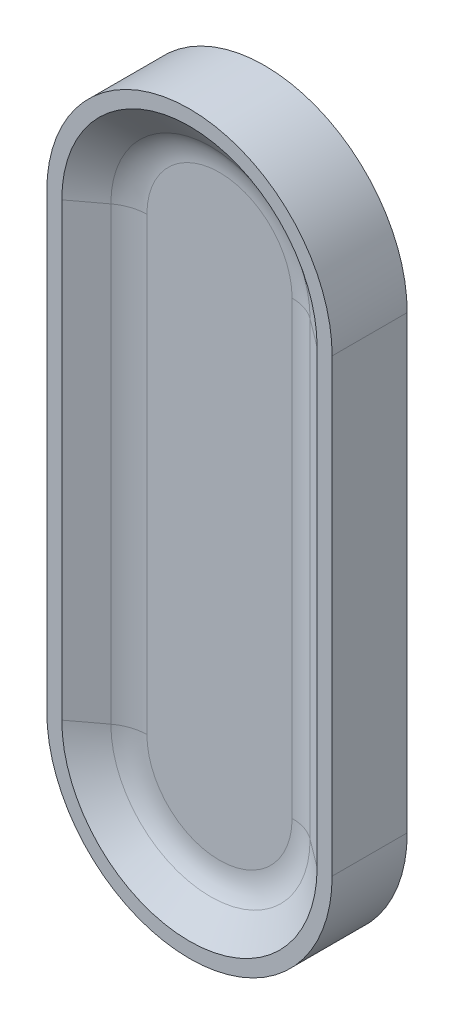
ISO-10303-21;
HEADER;
FILE_DESCRIPTION(('STEP AP214'),'2;1');
FILE_NAME('part.step','',(''),(''),'','','');
FILE_SCHEMA(('AUTOMOTIVE_DESIGN { 1 0 10303 214 1 1 1 1 }'));
ENDSEC;
DATA;
#1=APPLICATION_CONTEXT('core data for automotive mechanical design processes');
#2=APPLICATION_PROTOCOL_DEFINITION('international standard','automotive_design',2000,#1);
#3=PRODUCT_CONTEXT('',#1,'mechanical');
#4=PRODUCT('Part','Part','',(#3));
#5=PRODUCT_RELATED_PRODUCT_CATEGORY('part','',(#4));
#6=PRODUCT_DEFINITION_FORMATION('','',#4);
#7=PRODUCT_DEFINITION_CONTEXT('part definition',#1,'design');
#8=PRODUCT_DEFINITION('design','',#6,#7);
#9=PRODUCT_DEFINITION_SHAPE('','',#8);
#10=(LENGTH_UNIT() NAMED_UNIT(*) SI_UNIT(.MILLI.,.METRE.));
#11=(NAMED_UNIT(*) PLANE_ANGLE_UNIT() SI_UNIT($,.RADIAN.));
#12=(NAMED_UNIT(*) SI_UNIT($,.STERADIAN.) SOLID_ANGLE_UNIT());
#13=UNCERTAINTY_MEASURE_WITH_UNIT(LENGTH_MEASURE(1.E-05),#10,'distance_accuracy_value','');
#14=(GEOMETRIC_REPRESENTATION_CONTEXT(3) GLOBAL_UNCERTAINTY_ASSIGNED_CONTEXT((#13)) GLOBAL_UNIT_ASSIGNED_CONTEXT((#10,
#11,#12)) REPRESENTATION_CONTEXT('',''));
#15=CARTESIAN_POINT('',(0.,0.,0.));
#16=DIRECTION('',(0.,0.,1.));
#17=DIRECTION('',(1.,0.,0.));
#18=AXIS2_PLACEMENT_3D('',#15,#16,#17);
#19=CARTESIAN_POINT('',(0.,-15.,5.));
#20=DIRECTION('',(0.,0.,-1.));
#21=DIRECTION('',(-1.,0.,0.));
#22=AXIS2_PLACEMENT_3D('',#19,#20,#21);
#23=CYLINDRICAL_SURFACE('',#22,9.50000000000001);
#24=CARTESIAN_POINT('',(0.,-15.,0.));
#25=DIRECTION('',(0.,0.,1.));
#26=DIRECTION('',(1.,0.,0.));
#27=AXIS2_PLACEMENT_3D('',#24,#25,#26);
#28=CIRCLE('',#27,9.50000000000001);
#29=CARTESIAN_POINT('',(-9.50000000000001,-15.,0.));
#30=VERTEX_POINT('',#29);
#31=CARTESIAN_POINT('',(9.50000000000001,-15.,0.));
#32=VERTEX_POINT('',#31);
#33=EDGE_CURVE('E140',#30,#32,#28,.T.);
#34=ORIENTED_EDGE('',*,*,#33,.T.);
#35=DIRECTION('',(0.,0.,-1.));
#36=VECTOR('',#35,1.);
#37=CARTESIAN_POINT('',(9.50000000000001,-15.,5.));
#38=LINE('',#37,#36);
#39=CARTESIAN_POINT('',(9.50000000000001,-15.,5.));
#40=VERTEX_POINT('',#39);
#41=EDGE_CURVE('E121',#40,#32,#38,.T.);
#42=ORIENTED_EDGE('',*,*,#41,.F.);
#43=CARTESIAN_POINT('',(0.,-15.,5.));
#44=DIRECTION('',(0.,0.,1.));
#45=DIRECTION('',(1.,0.,0.));
#46=AXIS2_PLACEMENT_3D('',#43,#44,#45);
#47=CIRCLE('',#46,9.50000000000001);
#48=CARTESIAN_POINT('',(-9.50000000000001,-15.,5.));
#49=VERTEX_POINT('',#48);
#50=EDGE_CURVE('E128',#49,#40,#47,.T.);
#51=ORIENTED_EDGE('',*,*,#50,.F.);
#52=DIRECTION('',(0.,0.,-1.));
#53=VECTOR('',#52,1.);
#54=CARTESIAN_POINT('',(-9.50000000000001,-15.,5.));
#55=LINE('',#54,#53);
#56=EDGE_CURVE('E322',#49,#30,#55,.T.);
#57=ORIENTED_EDGE('',*,*,#56,.T.);
#58=EDGE_LOOP('',(#34,#42,#51,#57));
#59=FACE_BOUND('',#58,.T.);
#60=ADVANCED_FACE('F39',(#59),#23,.T.);
#61=CARTESIAN_POINT('',(9.50000000000001,-15.,5.));
#62=DIRECTION('',(-1.,0.,0.));
#63=DIRECTION('',(0.,-1.,0.));
#64=AXIS2_PLACEMENT_3D('',#61,#62,#63);
#65=PLANE('',#64);
#66=DIRECTION('',(0.,1.,0.));
#67=VECTOR('',#66,1.);
#68=CARTESIAN_POINT('',(9.50000000000001,-15.,0.));
#69=LINE('',#68,#67);
#70=CARTESIAN_POINT('',(9.5,15.,0.));
#71=VERTEX_POINT('',#70);
#72=EDGE_CURVE('E320',#32,#71,#69,.T.);
#73=ORIENTED_EDGE('',*,*,#72,.T.);
#74=DIRECTION('',(0.,0.,-1.));
#75=VECTOR('',#74,1.);
#76=CARTESIAN_POINT('',(9.5,15.,5.));
#77=LINE('',#76,#75);
#78=CARTESIAN_POINT('',(9.5,15.,5.));
#79=VERTEX_POINT('',#78);
#80=EDGE_CURVE('E124',#79,#71,#77,.T.);
#81=ORIENTED_EDGE('',*,*,#80,.F.);
#82=DIRECTION('',(0.,1.,0.));
#83=VECTOR('',#82,1.);
#84=CARTESIAN_POINT('',(9.50000000000001,-15.,5.));
#85=LINE('',#84,#83);
#86=EDGE_CURVE('E117',#40,#79,#85,.T.);
#87=ORIENTED_EDGE('',*,*,#86,.F.);
#88=ORIENTED_EDGE('',*,*,#41,.T.);
#89=EDGE_LOOP('',(#73,#81,#87,#88));
#90=FACE_BOUND('',#89,.T.);
#91=ADVANCED_FACE('F119',(#90),#65,.F.);
#92=CARTESIAN_POINT('',(0.,15.,5.));
#93=DIRECTION('',(0.,0.,-1.));
#94=DIRECTION('',(-1.,0.,0.));
#95=AXIS2_PLACEMENT_3D('',#92,#93,#94);
#96=CYLINDRICAL_SURFACE('',#95,9.50000000000001);
#97=CARTESIAN_POINT('',(0.,15.,0.));
#98=DIRECTION('',(0.,0.,1.));
#99=DIRECTION('',(1.,0.,0.));
#100=AXIS2_PLACEMENT_3D('',#97,#98,#99);
#101=CIRCLE('',#100,9.50000000000001);
#102=CARTESIAN_POINT('',(-9.50000000000001,15.,0.));
#103=VERTEX_POINT('',#102);
#104=EDGE_CURVE('E317',#71,#103,#101,.T.);
#105=ORIENTED_EDGE('',*,*,#104,.T.);
#106=DIRECTION('',(0.,0.,-1.));
#107=VECTOR('',#106,1.);
#108=CARTESIAN_POINT('',(-9.50000000000001,15.,5.));
#109=LINE('',#108,#107);
#110=CARTESIAN_POINT('',(-9.50000000000001,15.,5.));
#111=VERTEX_POINT('',#110);
#112=EDGE_CURVE('E145',#111,#103,#109,.T.);
#113=ORIENTED_EDGE('',*,*,#112,.F.);
#114=CARTESIAN_POINT('',(0.,15.,5.));
#115=DIRECTION('',(0.,0.,1.));
#116=DIRECTION('',(1.,0.,0.));
#117=AXIS2_PLACEMENT_3D('',#114,#115,#116);
#118=CIRCLE('',#117,9.50000000000001);
#119=EDGE_CURVE('E127',#79,#111,#118,.T.);
#120=ORIENTED_EDGE('',*,*,#119,.F.);
#121=ORIENTED_EDGE('',*,*,#80,.T.);
#122=EDGE_LOOP('',(#105,#113,#120,#121));
#123=FACE_BOUND('',#122,.T.);
#124=ADVANCED_FACE('F229',(#123),#96,.T.);
#125=CARTESIAN_POINT('',(-9.50000000000001,-15.,5.));
#126=DIRECTION('',(1.,0.,0.));
#127=DIRECTION('',(0.,1.,0.));
#128=AXIS2_PLACEMENT_3D('',#125,#126,#127);
#129=PLANE('',#128);
#130=DIRECTION('',(0.,-1.,0.));
#131=VECTOR('',#130,1.);
#132=CARTESIAN_POINT('',(-9.50000000000001,-15.,0.));
#133=LINE('',#132,#131);
#134=EDGE_CURVE('E137',#103,#30,#133,.T.);
#135=ORIENTED_EDGE('',*,*,#134,.T.);
#136=ORIENTED_EDGE('',*,*,#56,.F.);
#137=DIRECTION('',(0.,-1.,0.));
#138=VECTOR('',#137,1.);
#139=CARTESIAN_POINT('',(-9.50000000000001,-15.,5.));
#140=LINE('',#139,#138);
#141=EDGE_CURVE('E133',#111,#49,#140,.T.);
#142=ORIENTED_EDGE('',*,*,#141,.F.);
#143=ORIENTED_EDGE('',*,*,#112,.T.);
#144=EDGE_LOOP('',(#135,#136,#142,#143));
#145=FACE_BOUND('',#144,.T.);
#146=ADVANCED_FACE('F279',(#145),#129,.F.);
#147=CARTESIAN_POINT('',(0.,-15.,5.));
#148=DIRECTION('',(0.,0.,1.));
#149=DIRECTION('',(1.,0.,0.));
#150=AXIS2_PLACEMENT_3D('',#147,#148,#149);
#151=PLANE('',#150);
#152=DIRECTION('',(0.,-1.,0.));
#153=VECTOR('',#152,1.);
#154=CARTESIAN_POINT('',(8.50000000000001,-15.,5.));
#155=LINE('',#154,#153);
#156=CARTESIAN_POINT('',(8.5,15.,5.));
#157=VERTEX_POINT('',#156);
#158=CARTESIAN_POINT('',(8.50000000000001,-15.,5.));
#159=VERTEX_POINT('',#158);
#160=EDGE_CURVE('E151',#157,#159,#155,.T.);
#161=ORIENTED_EDGE('',*,*,#160,.T.);
#162=CARTESIAN_POINT('',(0.,-15.,5.));
#163=DIRECTION('',(0.,0.,1.));
#164=DIRECTION('',(1.,0.,0.));
#165=AXIS2_PLACEMENT_3D('',#162,#163,#164);
#166=CIRCLE('',#165,8.50000000000001);
#167=CARTESIAN_POINT('',(-8.50000000000001,-15.,5.));
#168=VERTEX_POINT('',#167);
#169=EDGE_CURVE('E153',#159,#168,#166,.F.);
#170=ORIENTED_EDGE('',*,*,#169,.T.);
#171=DIRECTION('',(0.,1.,0.));
#172=VECTOR('',#171,1.);
#173=CARTESIAN_POINT('',(-8.50000000000001,15.,5.));
#174=LINE('',#173,#172);
#175=CARTESIAN_POINT('',(-8.50000000000001,15.,5.));
#176=VERTEX_POINT('',#175);
#177=EDGE_CURVE('E143',#168,#176,#174,.T.);
#178=ORIENTED_EDGE('',*,*,#177,.T.);
#179=CARTESIAN_POINT('',(0.,15.,5.));
#180=DIRECTION('',(0.,0.,1.));
#181=DIRECTION('',(1.,0.,0.));
#182=AXIS2_PLACEMENT_3D('',#179,#180,#181);
#183=CIRCLE('',#182,8.50000000000001);
#184=EDGE_CURVE('E141',#176,#157,#183,.F.);
#185=ORIENTED_EDGE('',*,*,#184,.T.);
#186=EDGE_LOOP('',(#161,#170,#178,#185));
#187=FACE_BOUND('',#186,.T.);
#188=ORIENTED_EDGE('',*,*,#50,.T.);
#189=ORIENTED_EDGE('',*,*,#86,.T.);
#190=ORIENTED_EDGE('',*,*,#119,.T.);
#191=ORIENTED_EDGE('',*,*,#141,.T.);
#192=EDGE_LOOP('',(#188,#189,#190,#191));
#193=FACE_BOUND('',#192,.T.);
#194=ADVANCED_FACE('F131',(#187,#193),#151,.T.);
#195=CARTESIAN_POINT('',(0.,-15.,0.));
#196=DIRECTION('',(0.,0.,1.));
#197=DIRECTION('',(1.,0.,0.));
#198=AXIS2_PLACEMENT_3D('',#195,#196,#197);
#199=PLANE('',#198);
#200=ORIENTED_EDGE('',*,*,#33,.F.);
#201=ORIENTED_EDGE('',*,*,#134,.F.);
#202=ORIENTED_EDGE('',*,*,#104,.F.);
#203=ORIENTED_EDGE('',*,*,#72,.F.);
#204=EDGE_LOOP('',(#200,#201,#202,#203));
#205=FACE_BOUND('',#204,.T.);
#206=ADVANCED_FACE('F213',(#205),#199,.F.);
#207=CARTESIAN_POINT('',(0.,0.,3.));
#208=DIRECTION('',(0.,0.,1.));
#209=DIRECTION('',(1.,0.,0.));
#210=AXIS2_PLACEMENT_3D('',#207,#208,#209);
#211=PLANE('',#210);
#212=CARTESIAN_POINT('',(0.,-15.,3.));
#213=DIRECTION('',(0.,0.,1.));
#214=DIRECTION('',(1.,0.,0.));
#215=AXIS2_PLACEMENT_3D('',#212,#213,#214);
#216=CIRCLE('',#215,4.83333333333334);
#217=CARTESIAN_POINT('',(-4.83333333333335,-15.,3.));
#218=VERTEX_POINT('',#217);
#219=CARTESIAN_POINT('',(4.83333333333334,-15.,3.));
#220=VERTEX_POINT('',#219);
#221=EDGE_CURVE('E169',#218,#220,#216,.T.);
#222=ORIENTED_EDGE('',*,*,#221,.T.);
#223=DIRECTION('',(0.,1.,0.));
#224=VECTOR('',#223,1.);
#225=CARTESIAN_POINT('',(4.83333333333333,15.,3.));
#226=LINE('',#225,#224);
#227=CARTESIAN_POINT('',(4.83333333333333,15.,3.));
#228=VERTEX_POINT('',#227);
#229=EDGE_CURVE('E171',#220,#228,#226,.T.);
#230=ORIENTED_EDGE('',*,*,#229,.T.);
#231=CARTESIAN_POINT('',(0.,15.,3.));
#232=DIRECTION('',(0.,0.,1.));
#233=DIRECTION('',(1.,0.,0.));
#234=AXIS2_PLACEMENT_3D('',#231,#232,#233);
#235=CIRCLE('',#234,4.83333333333334);
#236=CARTESIAN_POINT('',(-4.83333333333334,15.,3.));
#237=VERTEX_POINT('',#236);
#238=EDGE_CURVE('E156',#228,#237,#235,.T.);
#239=ORIENTED_EDGE('',*,*,#238,.T.);
#240=DIRECTION('',(0.,-1.,0.));
#241=VECTOR('',#240,1.);
#242=CARTESIAN_POINT('',(-4.83333333333335,-15.,3.));
#243=LINE('',#242,#241);
#244=EDGE_CURVE('E167',#237,#218,#243,.T.);
#245=ORIENTED_EDGE('',*,*,#244,.T.);
#246=EDGE_LOOP('',(#222,#230,#239,#245));
#247=FACE_BOUND('',#246,.T.);
#248=ADVANCED_FACE('F211',(#247),#211,.T.);
#249=CARTESIAN_POINT('',(0.,15.,2.));
#250=DIRECTION('',(0.,0.,1.));
#251=DIRECTION('',(1.,0.,0.));
#252=AXIS2_PLACEMENT_3D('',#249,#250,#251);
#253=CONICAL_SURFACE('',#252,4.50000000000001,0.927295218001612);
#254=DIRECTION('',(-0.8,0.,0.6));
#255=VECTOR('',#254,1.);
#256=CARTESIAN_POINT('',(-4.50000000000001,15.,2.));
#257=LINE('',#256,#255);
#258=CARTESIAN_POINT('',(-6.63333333333335,15.,3.6));
#259=VERTEX_POINT('',#258);
#260=EDGE_CURVE('E164',#259,#176,#257,.T.);
#261=ORIENTED_EDGE('',*,*,#260,.F.);
#262=CARTESIAN_POINT('',(0.,15.,3.6));
#263=DIRECTION('',(0.,0.,1.));
#264=DIRECTION('',(1.,0.,0.));
#265=AXIS2_PLACEMENT_3D('',#262,#263,#264);
#266=CIRCLE('',#265,6.63333333333334);
#267=CARTESIAN_POINT('',(6.63333333333333,15.,3.6));
#268=VERTEX_POINT('',#267);
#269=EDGE_CURVE('E11',#259,#268,#266,.F.);
#270=ORIENTED_EDGE('',*,*,#269,.T.);
#271=DIRECTION('',(-0.8,0.,-0.6));
#272=VECTOR('',#271,1.);
#273=CARTESIAN_POINT('',(8.5,15.,5.));
#274=LINE('',#273,#272);
#275=EDGE_CURVE('E161',#157,#268,#274,.T.);
#276=ORIENTED_EDGE('',*,*,#275,.F.);
#277=ORIENTED_EDGE('',*,*,#184,.F.);
#278=EDGE_LOOP('',(#261,#270,#276,#277));
#279=FACE_BOUND('',#278,.T.);
#280=ADVANCED_FACE('F200',(#279),#253,.F.);
#281=CARTESIAN_POINT('',(-4.50000000000001,0.,2.));
#282=DIRECTION('',(0.6,0.,0.8));
#283=DIRECTION('',(0.,1.,0.));
#284=AXIS2_PLACEMENT_3D('',#281,#282,#283);
#285=PLANE('',#284);
#286=DIRECTION('',(-0.8,0.,0.6));
#287=VECTOR('',#286,1.);
#288=CARTESIAN_POINT('',(-4.50000000000001,-15.,2.));
#289=LINE('',#288,#287);
#290=CARTESIAN_POINT('',(-6.63333333333335,-15.,3.6));
#291=VERTEX_POINT('',#290);
#292=EDGE_CURVE('E159',#291,#168,#289,.T.);
#293=ORIENTED_EDGE('',*,*,#292,.F.);
#294=DIRECTION('',(0.,-1.,0.));
#295=VECTOR('',#294,1.);
#296=CARTESIAN_POINT('',(-6.63333333333335,15.,3.6));
#297=LINE('',#296,#295);
#298=EDGE_CURVE('E48',#291,#259,#297,.F.);
#299=ORIENTED_EDGE('',*,*,#298,.T.);
#300=ORIENTED_EDGE('',*,*,#260,.T.);
#301=ORIENTED_EDGE('',*,*,#177,.F.);
#302=EDGE_LOOP('',(#293,#299,#300,#301));
#303=FACE_BOUND('',#302,.T.);
#304=ADVANCED_FACE('F219',(#303),#285,.T.);
#305=CARTESIAN_POINT('',(4.5,0.,2.));
#306=DIRECTION('',(-0.6,0.,0.8));
#307=DIRECTION('',(0.,-1.,0.));
#308=AXIS2_PLACEMENT_3D('',#305,#306,#307);
#309=PLANE('',#308);
#310=ORIENTED_EDGE('',*,*,#275,.T.);
#311=DIRECTION('',(0.,1.,0.));
#312=VECTOR('',#311,1.);
#313=CARTESIAN_POINT('',(6.63333333333334,-15.,3.6));
#314=LINE('',#313,#312);
#315=CARTESIAN_POINT('',(6.63333333333334,-15.,3.6));
#316=VERTEX_POINT('',#315);
#317=EDGE_CURVE('E174',#268,#316,#314,.F.);
#318=ORIENTED_EDGE('',*,*,#317,.T.);
#319=DIRECTION('',(-0.8,0.,-0.6));
#320=VECTOR('',#319,1.);
#321=CARTESIAN_POINT('',(8.50000000000001,-15.,5.));
#322=LINE('',#321,#320);
#323=EDGE_CURVE('E157',#159,#316,#322,.T.);
#324=ORIENTED_EDGE('',*,*,#323,.F.);
#325=ORIENTED_EDGE('',*,*,#160,.F.);
#326=EDGE_LOOP('',(#310,#318,#324,#325));
#327=FACE_BOUND('',#326,.T.);
#328=ADVANCED_FACE('F205',(#327),#309,.T.);
#329=CARTESIAN_POINT('',(0.,-15.,2.));
#330=DIRECTION('',(0.,0.,1.));
#331=DIRECTION('',(1.,0.,0.));
#332=AXIS2_PLACEMENT_3D('',#329,#330,#331);
#333=CONICAL_SURFACE('',#332,4.50000000000001,0.927295218001612);
#334=ORIENTED_EDGE('',*,*,#323,.T.);
#335=CARTESIAN_POINT('',(0.,-15.,3.6));
#336=DIRECTION('',(0.,0.,1.));
#337=DIRECTION('',(1.,0.,0.));
#338=AXIS2_PLACEMENT_3D('',#335,#336,#337);
#339=CIRCLE('',#338,6.63333333333334);
#340=EDGE_CURVE('E63',#316,#291,#339,.F.);
#341=ORIENTED_EDGE('',*,*,#340,.T.);
#342=ORIENTED_EDGE('',*,*,#292,.T.);
#343=ORIENTED_EDGE('',*,*,#169,.F.);
#344=EDGE_LOOP('',(#334,#341,#342,#343));
#345=FACE_BOUND('',#344,.T.);
#346=ADVANCED_FACE('F233',(#345),#333,.F.);
#347=CARTESIAN_POINT('',(-4.83333333333335,0.,6.));
#348=DIRECTION('',(0.,1.,0.));
#349=DIRECTION('',(0.,0.,1.));
#350=AXIS2_PLACEMENT_3D('',#347,#348,#349);
#351=CYLINDRICAL_SURFACE('',#350,3.);
#352=CARTESIAN_POINT('',(-4.83333333333334,15.,6.));
#353=DIRECTION('',(0.,-1.,0.));
#354=DIRECTION('',(0.,0.,-1.));
#355=AXIS2_PLACEMENT_3D('',#352,#353,#354);
#356=CIRCLE('',#355,3.);
#357=EDGE_CURVE('E182',#259,#237,#356,.T.);
#358=ORIENTED_EDGE('',*,*,#357,.F.);
#359=ORIENTED_EDGE('',*,*,#298,.F.);
#360=CARTESIAN_POINT('',(-4.83333333333335,-15.,6.));
#361=DIRECTION('',(0.,1.,0.));
#362=DIRECTION('',(0.,0.,1.));
#363=AXIS2_PLACEMENT_3D('',#360,#361,#362);
#364=CIRCLE('',#363,3.);
#365=EDGE_CURVE('E43',#218,#291,#364,.T.);
#366=ORIENTED_EDGE('',*,*,#365,.F.);
#367=ORIENTED_EDGE('',*,*,#244,.F.);
#368=EDGE_LOOP('',(#358,#359,#366,#367));
#369=FACE_BOUND('',#368,.T.);
#370=ADVANCED_FACE('F41',(#369),#351,.F.);
#371=CARTESIAN_POINT('',(0.,-15.,6.));
#372=DIRECTION('',(0.,0.,1.));
#373=DIRECTION('',(1.,0.,0.));
#374=AXIS2_PLACEMENT_3D('',#371,#372,#373);
#375=TOROIDAL_SURFACE('',#374,4.83333333333334,3.);
#376=ORIENTED_EDGE('',*,*,#365,.T.);
#377=ORIENTED_EDGE('',*,*,#340,.F.);
#378=CARTESIAN_POINT('',(4.83333333333334,-15.,6.));
#379=DIRECTION('',(0.,-1.,0.));
#380=DIRECTION('',(0.,0.,-1.));
#381=AXIS2_PLACEMENT_3D('',#378,#379,#380);
#382=CIRCLE('',#381,3.);
#383=EDGE_CURVE('E181',#220,#316,#382,.T.);
#384=ORIENTED_EDGE('',*,*,#383,.F.);
#385=ORIENTED_EDGE('',*,*,#221,.F.);
#386=EDGE_LOOP('',(#376,#377,#384,#385));
#387=FACE_BOUND('',#386,.T.);
#388=ADVANCED_FACE('F192',(#387),#375,.F.);
#389=CARTESIAN_POINT('',(0.,15.,6.));
#390=DIRECTION('',(0.,0.,1.));
#391=DIRECTION('',(1.,0.,0.));
#392=AXIS2_PLACEMENT_3D('',#389,#390,#391);
#393=TOROIDAL_SURFACE('',#392,4.83333333333334,3.);
#394=ORIENTED_EDGE('',*,*,#357,.T.);
#395=ORIENTED_EDGE('',*,*,#238,.F.);
#396=CARTESIAN_POINT('',(4.83333333333333,15.,6.));
#397=DIRECTION('',(0.,1.,0.));
#398=DIRECTION('',(0.,0.,1.));
#399=AXIS2_PLACEMENT_3D('',#396,#397,#398);
#400=CIRCLE('',#399,3.);
#401=EDGE_CURVE('E179',#268,#228,#400,.T.);
#402=ORIENTED_EDGE('',*,*,#401,.F.);
#403=ORIENTED_EDGE('',*,*,#269,.F.);
#404=EDGE_LOOP('',(#394,#395,#402,#403));
#405=FACE_BOUND('',#404,.T.);
#406=ADVANCED_FACE('F197',(#405),#393,.F.);
#407=CARTESIAN_POINT('',(4.83333333333334,0.,6.));
#408=DIRECTION('',(0.,-1.,0.));
#409=DIRECTION('',(1.,0.,0.));
#410=AXIS2_PLACEMENT_3D('',#407,#408,#409);
#411=CYLINDRICAL_SURFACE('',#410,3.);
#412=ORIENTED_EDGE('',*,*,#383,.T.);
#413=ORIENTED_EDGE('',*,*,#317,.F.);
#414=ORIENTED_EDGE('',*,*,#401,.T.);
#415=ORIENTED_EDGE('',*,*,#229,.F.);
#416=EDGE_LOOP('',(#412,#413,#414,#415));
#417=FACE_BOUND('',#416,.T.);
#418=ADVANCED_FACE('F208',(#417),#411,.F.);
#419=CLOSED_SHELL('',(#60,#91,#124,#146,#194,#206,#248,#280,#304,#328,#346,#370,#388,#406,#418));
#420=MANIFOLD_SOLID_BREP('B2',#419);
#421=ADVANCED_BREP_SHAPE_REPRESENTATION('',(#18,#420),#14);
#422=SHAPE_DEFINITION_REPRESENTATION(#9,#421);
ENDSEC;
END-ISO-10303-21;
